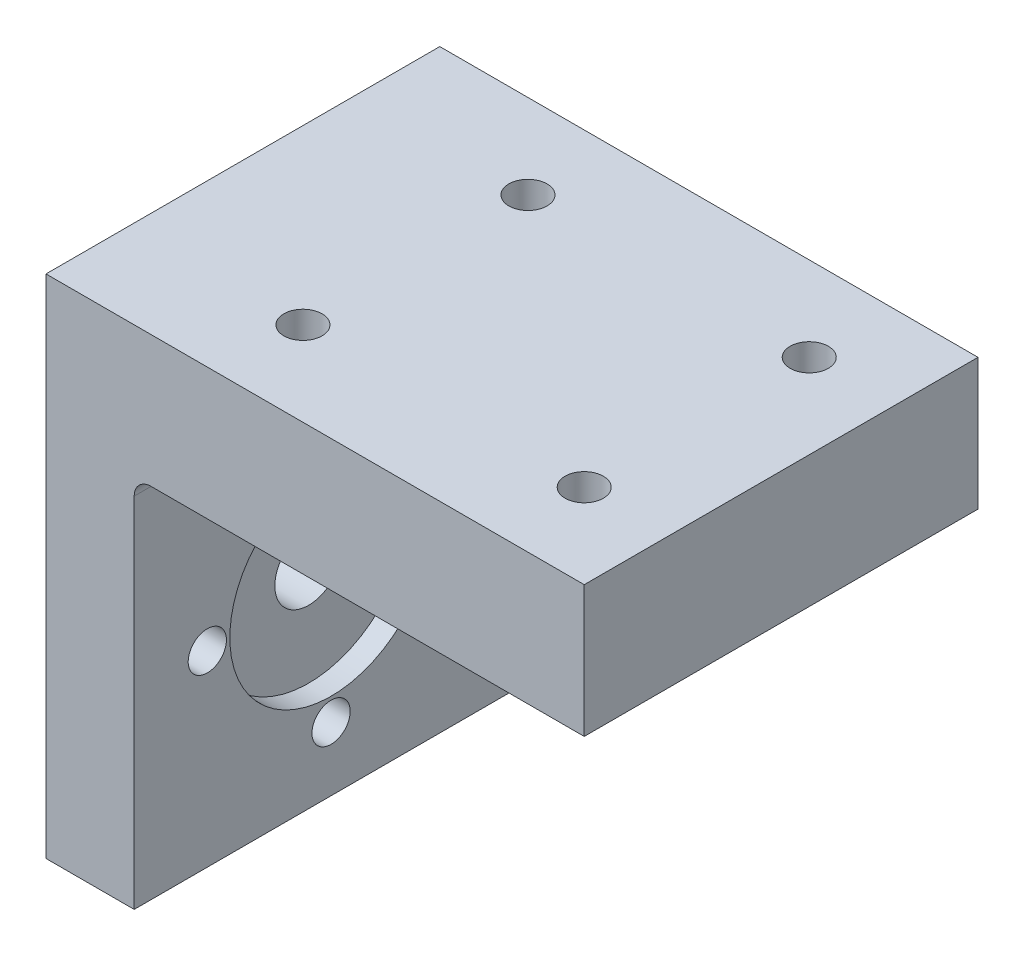
ISO-10303-21;
HEADER;
FILE_DESCRIPTION(('STEP AP214'),'2;1');
FILE_NAME('part.step','',(''),(''),'','','');
FILE_SCHEMA(('AUTOMOTIVE_DESIGN { 1 0 10303 214 1 1 1 1 }'));
ENDSEC;
DATA;
#1=APPLICATION_CONTEXT('core data for automotive mechanical design processes');
#2=APPLICATION_PROTOCOL_DEFINITION('international standard','automotive_design',2000,#1);
#3=PRODUCT_CONTEXT('',#1,'mechanical');
#4=PRODUCT('Part','Part','',(#3));
#5=PRODUCT_RELATED_PRODUCT_CATEGORY('part','',(#4));
#6=PRODUCT_DEFINITION_FORMATION('','',#4);
#7=PRODUCT_DEFINITION_CONTEXT('part definition',#1,'design');
#8=PRODUCT_DEFINITION('design','',#6,#7);
#9=PRODUCT_DEFINITION_SHAPE('','',#8);
#10=(LENGTH_UNIT() NAMED_UNIT(*) SI_UNIT(.MILLI.,.METRE.));
#11=(NAMED_UNIT(*) PLANE_ANGLE_UNIT() SI_UNIT($,.RADIAN.));
#12=(NAMED_UNIT(*) SI_UNIT($,.STERADIAN.) SOLID_ANGLE_UNIT());
#13=UNCERTAINTY_MEASURE_WITH_UNIT(LENGTH_MEASURE(1.E-05),#10,'distance_accuracy_value','');
#14=(GEOMETRIC_REPRESENTATION_CONTEXT(3) GLOBAL_UNCERTAINTY_ASSIGNED_CONTEXT((#13)) GLOBAL_UNIT_ASSIGNED_CONTEXT((#10,
#11,#12)) REPRESENTATION_CONTEXT('',''));
#15=CARTESIAN_POINT('',(0.,0.,0.));
#16=DIRECTION('',(0.,0.,1.));
#17=DIRECTION('',(1.,0.,0.));
#18=AXIS2_PLACEMENT_3D('',#15,#16,#17);
#19=CARTESIAN_POINT('',(-7.83844459402521,-5.84243165003538,0.));
#20=DIRECTION('',(1.,0.,0.));
#21=DIRECTION('',(0.,0.,-1.));
#22=AXIS2_PLACEMENT_3D('',#19,#20,#21);
#23=CYLINDRICAL_SURFACE('',#22,3.);
#24=CARTESIAN_POINT('',(-7.83844459402521,-5.84243165003538,0.));
#25=DIRECTION('',(1.,0.,0.));
#26=DIRECTION('',(0.,0.,-1.));
#27=AXIS2_PLACEMENT_3D('',#24,#25,#26);
#28=CIRCLE('',#27,3.);
#29=CARTESIAN_POINT('',(-7.83844459402521,-5.84243165003538,-3.));
#30=VERTEX_POINT('',#29);
#31=EDGE_CURVE('E131',#30,#30,#28,.T.);
#32=ORIENTED_EDGE('',*,*,#31,.F.);
#33=EDGE_LOOP('',(#32));
#34=FACE_BOUND('',#33,.T.);
#35=CARTESIAN_POINT('',(-2.,-5.84243165003538,0.));
#36=DIRECTION('',(1.,0.,0.));
#37=DIRECTION('',(0.,0.,-1.));
#38=AXIS2_PLACEMENT_3D('',#35,#36,#37);
#39=CIRCLE('',#38,3.);
#40=CARTESIAN_POINT('',(-2.,-5.84243165003538,-3.));
#41=VERTEX_POINT('',#40);
#42=EDGE_CURVE('E181',#41,#41,#39,.F.);
#43=ORIENTED_EDGE('',*,*,#42,.F.);
#44=EDGE_LOOP('',(#43));
#45=FACE_BOUND('',#44,.T.);
#46=ADVANCED_FACE('F46',(#34,#45),#23,.F.);
#47=CARTESIAN_POINT('',(-7.83844459402521,22.5,17.5));
#48=DIRECTION('',(0.,1.,0.));
#49=DIRECTION('',(0.,0.,1.));
#50=AXIS2_PLACEMENT_3D('',#47,#48,#49);
#51=PLANE('',#50);
#52=CARTESIAN_POINT('',(32.5,22.5,10.));
#53=DIRECTION('',(0.,-1.,0.));
#54=DIRECTION('',(0.,0.,-1.));
#55=AXIS2_PLACEMENT_3D('',#52,#53,#54);
#56=CIRCLE('',#55,1.7);
#57=CARTESIAN_POINT('',(32.5,22.5,8.30000000000001));
#58=VERTEX_POINT('',#57);
#59=EDGE_CURVE('E381',#58,#58,#56,.T.);
#60=ORIENTED_EDGE('',*,*,#59,.T.);
#61=EDGE_LOOP('',(#60));
#62=FACE_BOUND('',#61,.T.);
#63=CARTESIAN_POINT('',(7.5,22.5,-10.));
#64=DIRECTION('',(0.,-1.,0.));
#65=DIRECTION('',(0.,0.,-1.));
#66=AXIS2_PLACEMENT_3D('',#63,#64,#65);
#67=CIRCLE('',#66,1.7);
#68=CARTESIAN_POINT('',(7.5,22.5,-11.7));
#69=VERTEX_POINT('',#68);
#70=EDGE_CURVE('E374',#69,#69,#67,.T.);
#71=ORIENTED_EDGE('',*,*,#70,.T.);
#72=EDGE_LOOP('',(#71));
#73=FACE_BOUND('',#72,.T.);
#74=CARTESIAN_POINT('',(32.5,22.5,-9.99999999999999));
#75=DIRECTION('',(0.,-1.,0.));
#76=DIRECTION('',(0.,0.,-1.));
#77=AXIS2_PLACEMENT_3D('',#74,#75,#76);
#78=CIRCLE('',#77,1.7);
#79=CARTESIAN_POINT('',(32.5,22.5,-11.7));
#80=VERTEX_POINT('',#79);
#81=EDGE_CURVE('E457',#80,#80,#78,.T.);
#82=ORIENTED_EDGE('',*,*,#81,.T.);
#83=EDGE_LOOP('',(#82));
#84=FACE_BOUND('',#83,.T.);
#85=CARTESIAN_POINT('',(7.5,22.5,10.));
#86=DIRECTION('',(0.,-1.,0.));
#87=DIRECTION('',(0.,0.,-1.));
#88=AXIS2_PLACEMENT_3D('',#85,#86,#87);
#89=CIRCLE('',#88,1.7);
#90=CARTESIAN_POINT('',(7.5,22.5,8.30000000000001));
#91=VERTEX_POINT('',#90);
#92=EDGE_CURVE('E394',#91,#91,#89,.T.);
#93=ORIENTED_EDGE('',*,*,#92,.T.);
#94=EDGE_LOOP('',(#93));
#95=FACE_BOUND('',#94,.T.);
#96=DIRECTION('',(1.,0.,0.));
#97=VECTOR('',#96,1.);
#98=CARTESIAN_POINT('',(-7.83844459402521,22.5,17.5));
#99=LINE('',#98,#97);
#100=CARTESIAN_POINT('',(-7.83844459402521,22.5,17.5));
#101=VERTEX_POINT('',#100);
#102=CARTESIAN_POINT('',(40.,22.5,17.5));
#103=VERTEX_POINT('',#102);
#104=EDGE_CURVE('E104',#101,#103,#99,.T.);
#105=ORIENTED_EDGE('',*,*,#104,.T.);
#106=DIRECTION('',(0.,0.,1.));
#107=VECTOR('',#106,1.);
#108=CARTESIAN_POINT('',(40.,22.5,17.5));
#109=LINE('',#108,#107);
#110=CARTESIAN_POINT('',(40.,22.5,-17.5));
#111=VERTEX_POINT('',#110);
#112=EDGE_CURVE('E108',#111,#103,#109,.T.);
#113=ORIENTED_EDGE('',*,*,#112,.F.);
#114=DIRECTION('',(1.,0.,0.));
#115=VECTOR('',#114,1.);
#116=CARTESIAN_POINT('',(-7.83844459402521,22.5,-17.5));
#117=LINE('',#116,#115);
#118=CARTESIAN_POINT('',(-7.83844459402521,22.5,-17.5));
#119=VERTEX_POINT('',#118);
#120=EDGE_CURVE('E175',#119,#111,#117,.T.);
#121=ORIENTED_EDGE('',*,*,#120,.F.);
#122=DIRECTION('',(0.,0.,1.));
#123=VECTOR('',#122,1.);
#124=CARTESIAN_POINT('',(-7.83844459402521,22.5,17.5));
#125=LINE('',#124,#123);
#126=EDGE_CURVE('E112',#119,#101,#125,.T.);
#127=ORIENTED_EDGE('',*,*,#126,.T.);
#128=EDGE_LOOP('',(#105,#113,#121,#127));
#129=FACE_BOUND('',#128,.T.);
#130=ADVANCED_FACE('F110',(#62,#73,#84,#95,#129),#51,.T.);
#131=CARTESIAN_POINT('',(-7.83844459402521,-22.5,-17.5));
#132=DIRECTION('',(0.,0.,-1.));
#133=DIRECTION('',(-1.,0.,0.));
#134=AXIS2_PLACEMENT_3D('',#131,#132,#133);
#135=PLANE('',#134);
#136=DIRECTION('',(0.,1.,0.));
#137=VECTOR('',#136,1.);
#138=CARTESIAN_POINT('',(0.,-22.5,-17.5));
#139=LINE('',#138,#137);
#140=CARTESIAN_POINT('',(0.,-22.5,-17.5));
#141=VERTEX_POINT('',#140);
#142=CARTESIAN_POINT('',(0.,9.31513669992924,-17.5));
#143=VERTEX_POINT('',#142);
#144=EDGE_CURVE('E154',#141,#143,#139,.T.);
#145=ORIENTED_EDGE('',*,*,#144,.F.);
#146=DIRECTION('',(1.,0.,0.));
#147=VECTOR('',#146,1.);
#148=CARTESIAN_POINT('',(-7.83844459402521,-22.5,-17.5));
#149=LINE('',#148,#147);
#150=CARTESIAN_POINT('',(-7.83844459402521,-22.5,-17.5));
#151=VERTEX_POINT('',#150);
#152=EDGE_CURVE('E180',#151,#141,#149,.T.);
#153=ORIENTED_EDGE('',*,*,#152,.F.);
#154=DIRECTION('',(0.,1.,0.));
#155=VECTOR('',#154,1.);
#156=CARTESIAN_POINT('',(-7.83844459402521,-22.5,-17.5));
#157=LINE('',#156,#155);
#158=EDGE_CURVE('E119',#151,#119,#157,.T.);
#159=ORIENTED_EDGE('',*,*,#158,.T.);
#160=ORIENTED_EDGE('',*,*,#120,.T.);
#161=DIRECTION('',(0.,1.,0.));
#162=VECTOR('',#161,1.);
#163=CARTESIAN_POINT('',(40.,22.5,-17.5));
#164=LINE('',#163,#162);
#165=CARTESIAN_POINT('',(40.,10.8151366999293,-17.5));
#166=VERTEX_POINT('',#165);
#167=EDGE_CURVE('E134',#166,#111,#164,.T.);
#168=ORIENTED_EDGE('',*,*,#167,.F.);
#169=DIRECTION('',(-1.,0.,0.));
#170=VECTOR('',#169,1.);
#171=CARTESIAN_POINT('',(40.,10.8151366999293,-17.5));
#172=LINE('',#171,#170);
#173=CARTESIAN_POINT('',(1.5,10.8151366999293,-17.5));
#174=VERTEX_POINT('',#173);
#175=EDGE_CURVE('E148',#166,#174,#172,.T.);
#176=ORIENTED_EDGE('',*,*,#175,.T.);
#177=CARTESIAN_POINT('',(1.5,9.31513669992926,-17.5));
#178=DIRECTION('',(0.,0.,-1.));
#179=DIRECTION('',(-1.,0.,0.));
#180=AXIS2_PLACEMENT_3D('',#177,#178,#179);
#181=CIRCLE('',#180,1.5);
#182=EDGE_CURVE('E54',#174,#143,#181,.F.);
#183=ORIENTED_EDGE('',*,*,#182,.T.);
#184=EDGE_LOOP('',(#145,#153,#159,#160,#168,#176,#183));
#185=FACE_BOUND('',#184,.T.);
#186=ADVANCED_FACE('F199',(#185),#135,.T.);
#187=CARTESIAN_POINT('',(-7.83844459402521,-22.5,17.5));
#188=DIRECTION('',(0.,-1.,0.));
#189=DIRECTION('',(0.,0.,-1.));
#190=AXIS2_PLACEMENT_3D('',#187,#188,#189);
#191=PLANE('',#190);
#192=DIRECTION('',(0.,0.,-1.));
#193=VECTOR('',#192,1.);
#194=CARTESIAN_POINT('',(0.,-22.5,17.5));
#195=LINE('',#194,#193);
#196=CARTESIAN_POINT('',(0.,-22.5,17.5));
#197=VERTEX_POINT('',#196);
#198=EDGE_CURVE('E170',#197,#141,#195,.T.);
#199=ORIENTED_EDGE('',*,*,#198,.F.);
#200=DIRECTION('',(1.,0.,0.));
#201=VECTOR('',#200,1.);
#202=CARTESIAN_POINT('',(-7.83844459402521,-22.5,17.5));
#203=LINE('',#202,#201);
#204=CARTESIAN_POINT('',(-7.83844459402521,-22.5,17.5));
#205=VERTEX_POINT('',#204);
#206=EDGE_CURVE('E117',#205,#197,#203,.T.);
#207=ORIENTED_EDGE('',*,*,#206,.F.);
#208=DIRECTION('',(0.,0.,-1.));
#209=VECTOR('',#208,1.);
#210=CARTESIAN_POINT('',(-7.83844459402521,-22.5,17.5));
#211=LINE('',#210,#209);
#212=EDGE_CURVE('E158',#205,#151,#211,.T.);
#213=ORIENTED_EDGE('',*,*,#212,.T.);
#214=ORIENTED_EDGE('',*,*,#152,.T.);
#215=EDGE_LOOP('',(#199,#207,#213,#214));
#216=FACE_BOUND('',#215,.T.);
#217=ADVANCED_FACE('F210',(#216),#191,.T.);
#218=CARTESIAN_POINT('',(-7.83844459402521,-22.5,17.5));
#219=DIRECTION('',(0.,0.,1.));
#220=DIRECTION('',(1.,0.,0.));
#221=AXIS2_PLACEMENT_3D('',#218,#219,#220);
#222=PLANE('',#221);
#223=DIRECTION('',(0.,-1.,0.));
#224=VECTOR('',#223,1.);
#225=CARTESIAN_POINT('',(0.,-22.5,17.5));
#226=LINE('',#225,#224);
#227=CARTESIAN_POINT('',(0.,9.31513669992924,17.5));
#228=VERTEX_POINT('',#227);
#229=EDGE_CURVE('E151',#228,#197,#226,.T.);
#230=ORIENTED_EDGE('',*,*,#229,.F.);
#231=CARTESIAN_POINT('',(1.5,9.31513669992925,17.5));
#232=DIRECTION('',(0.,0.,1.));
#233=DIRECTION('',(1.,0.,0.));
#234=AXIS2_PLACEMENT_3D('',#231,#232,#233);
#235=CIRCLE('',#234,1.5);
#236=CARTESIAN_POINT('',(1.5,10.8151366999293,17.5));
#237=VERTEX_POINT('',#236);
#238=EDGE_CURVE('E11',#228,#237,#235,.F.);
#239=ORIENTED_EDGE('',*,*,#238,.T.);
#240=DIRECTION('',(-1.,0.,0.));
#241=VECTOR('',#240,1.);
#242=CARTESIAN_POINT('',(40.,10.8151366999293,17.5));
#243=LINE('',#242,#241);
#244=CARTESIAN_POINT('',(40.,10.8151366999293,17.5));
#245=VERTEX_POINT('',#244);
#246=EDGE_CURVE('E123',#245,#237,#243,.T.);
#247=ORIENTED_EDGE('',*,*,#246,.F.);
#248=DIRECTION('',(0.,-1.,0.));
#249=VECTOR('',#248,1.);
#250=CARTESIAN_POINT('',(40.,22.5,17.5));
#251=LINE('',#250,#249);
#252=EDGE_CURVE('E118',#103,#245,#251,.T.);
#253=ORIENTED_EDGE('',*,*,#252,.F.);
#254=ORIENTED_EDGE('',*,*,#104,.F.);
#255=DIRECTION('',(0.,-1.,0.));
#256=VECTOR('',#255,1.);
#257=CARTESIAN_POINT('',(-7.83844459402521,-22.5,17.5));
#258=LINE('',#257,#256);
#259=EDGE_CURVE('E152',#101,#205,#258,.T.);
#260=ORIENTED_EDGE('',*,*,#259,.T.);
#261=ORIENTED_EDGE('',*,*,#206,.T.);
#262=EDGE_LOOP('',(#230,#239,#247,#253,#254,#260,#261));
#263=FACE_BOUND('',#262,.T.);
#264=ADVANCED_FACE('F122',(#263),#222,.T.);
#265=CARTESIAN_POINT('',(-7.83844459402521,0.,0.));
#266=DIRECTION('',(1.,0.,0.));
#267=DIRECTION('',(0.,0.,-1.));
#268=AXIS2_PLACEMENT_3D('',#265,#266,#267);
#269=PLANE('',#268);
#270=CARTESIAN_POINT('',(-7.83844459402521,-5.84243165003538,11.));
#271=DIRECTION('',(1.,0.,0.));
#272=DIRECTION('',(0.,0.,-1.));
#273=AXIS2_PLACEMENT_3D('',#270,#271,#272);
#274=CIRCLE('',#273,1.7);
#275=CARTESIAN_POINT('',(-7.83844459402521,-5.84243165003538,9.3));
#276=VERTEX_POINT('',#275);
#277=EDGE_CURVE('E426',#276,#276,#274,.T.);
#278=ORIENTED_EDGE('',*,*,#277,.T.);
#279=EDGE_LOOP('',(#278));
#280=FACE_BOUND('',#279,.T.);
#281=CARTESIAN_POINT('',(-7.83844459402521,-16.8424316500352,-1.90819582357449E-13));
#282=DIRECTION('',(1.,0.,0.));
#283=DIRECTION('',(0.,0.,-1.));
#284=AXIS2_PLACEMENT_3D('',#281,#282,#283);
#285=CIRCLE('',#284,1.7);
#286=CARTESIAN_POINT('',(-7.83844459402521,-16.8424316500352,-1.70000000000019));
#287=VERTEX_POINT('',#286);
#288=EDGE_CURVE('E413',#287,#287,#285,.T.);
#289=ORIENTED_EDGE('',*,*,#288,.T.);
#290=EDGE_LOOP('',(#289));
#291=FACE_BOUND('',#290,.T.);
#292=CARTESIAN_POINT('',(-7.83844459402521,-5.84243165003499,-11.));
#293=DIRECTION('',(1.,0.,0.));
#294=DIRECTION('',(0.,0.,-1.));
#295=AXIS2_PLACEMENT_3D('',#292,#293,#294);
#296=CIRCLE('',#295,1.7);
#297=CARTESIAN_POINT('',(-7.83844459402521,-5.84243165003499,-12.7));
#298=VERTEX_POINT('',#297);
#299=EDGE_CURVE('E415',#298,#298,#296,.T.);
#300=ORIENTED_EDGE('',*,*,#299,.T.);
#301=EDGE_LOOP('',(#300));
#302=FACE_BOUND('',#301,.T.);
#303=CARTESIAN_POINT('',(-7.83844459402521,5.15756834996478,2.69749500514394E-13));
#304=DIRECTION('',(1.,0.,0.));
#305=DIRECTION('',(0.,0.,-1.));
#306=AXIS2_PLACEMENT_3D('',#303,#304,#305);
#307=CIRCLE('',#306,1.7);
#308=CARTESIAN_POINT('',(-7.83844459402521,5.15756834996478,-1.69999999999973));
#309=VERTEX_POINT('',#308);
#310=EDGE_CURVE('E189',#309,#309,#307,.T.);
#311=ORIENTED_EDGE('',*,*,#310,.T.);
#312=EDGE_LOOP('',(#311));
#313=FACE_BOUND('',#312,.T.);
#314=ORIENTED_EDGE('',*,*,#31,.T.);
#315=EDGE_LOOP('',(#314));
#316=FACE_BOUND('',#315,.T.);
#317=ORIENTED_EDGE('',*,*,#126,.F.);
#318=ORIENTED_EDGE('',*,*,#158,.F.);
#319=ORIENTED_EDGE('',*,*,#212,.F.);
#320=ORIENTED_EDGE('',*,*,#259,.F.);
#321=EDGE_LOOP('',(#317,#318,#319,#320));
#322=FACE_BOUND('',#321,.T.);
#323=ADVANCED_FACE('F201',(#280,#291,#302,#313,#316,#322),#269,.F.);
#324=CARTESIAN_POINT('',(0.,0.,0.));
#325=DIRECTION('',(1.,0.,0.));
#326=DIRECTION('',(0.,0.,-1.));
#327=AXIS2_PLACEMENT_3D('',#324,#325,#326);
#328=PLANE('',#327);
#329=CARTESIAN_POINT('',(0.,-5.84243165003538,0.));
#330=DIRECTION('',(1.,0.,0.));
#331=DIRECTION('',(0.,0.,-1.));
#332=AXIS2_PLACEMENT_3D('',#329,#330,#331);
#333=CIRCLE('',#332,9.);
#334=CARTESIAN_POINT('',(0.,-5.84243165003538,-9.));
#335=VERTEX_POINT('',#334);
#336=EDGE_CURVE('E397',#335,#335,#333,.T.);
#337=ORIENTED_EDGE('',*,*,#336,.F.);
#338=EDGE_LOOP('',(#337));
#339=FACE_BOUND('',#338,.T.);
#340=CARTESIAN_POINT('',(0.,-5.84243165003538,11.));
#341=DIRECTION('',(1.,0.,0.));
#342=DIRECTION('',(0.,0.,-1.));
#343=AXIS2_PLACEMENT_3D('',#340,#341,#342);
#344=CIRCLE('',#343,1.7);
#345=CARTESIAN_POINT('',(0.,-5.84243165003538,9.3));
#346=VERTEX_POINT('',#345);
#347=EDGE_CURVE('E136',#346,#346,#344,.T.);
#348=ORIENTED_EDGE('',*,*,#347,.F.);
#349=EDGE_LOOP('',(#348));
#350=FACE_BOUND('',#349,.T.);
#351=CARTESIAN_POINT('',(0.,-16.8424316500352,-1.90819582357449E-13));
#352=DIRECTION('',(1.,0.,0.));
#353=DIRECTION('',(0.,0.,-1.));
#354=AXIS2_PLACEMENT_3D('',#351,#352,#353);
#355=CIRCLE('',#354,1.7);
#356=CARTESIAN_POINT('',(0.,-16.8424316500352,-1.70000000000019));
#357=VERTEX_POINT('',#356);
#358=EDGE_CURVE('E429',#357,#357,#355,.T.);
#359=ORIENTED_EDGE('',*,*,#358,.F.);
#360=EDGE_LOOP('',(#359));
#361=FACE_BOUND('',#360,.T.);
#362=CARTESIAN_POINT('',(0.,-5.84243165003499,-11.));
#363=DIRECTION('',(1.,0.,0.));
#364=DIRECTION('',(0.,0.,-1.));
#365=AXIS2_PLACEMENT_3D('',#362,#363,#364);
#366=CIRCLE('',#365,1.7);
#367=CARTESIAN_POINT('',(0.,-5.84243165003499,-12.7));
#368=VERTEX_POINT('',#367);
#369=EDGE_CURVE('E409',#368,#368,#366,.T.);
#370=ORIENTED_EDGE('',*,*,#369,.F.);
#371=EDGE_LOOP('',(#370));
#372=FACE_BOUND('',#371,.T.);
#373=CARTESIAN_POINT('',(0.,5.15756834996478,2.69749500514394E-13));
#374=DIRECTION('',(1.,0.,0.));
#375=DIRECTION('',(0.,0.,-1.));
#376=AXIS2_PLACEMENT_3D('',#373,#374,#375);
#377=CIRCLE('',#376,1.7);
#378=CARTESIAN_POINT('',(0.,5.15756834996478,-1.69999999999973));
#379=VERTEX_POINT('',#378);
#380=EDGE_CURVE('E418',#379,#379,#377,.T.);
#381=ORIENTED_EDGE('',*,*,#380,.F.);
#382=EDGE_LOOP('',(#381));
#383=FACE_BOUND('',#382,.T.);
#384=ORIENTED_EDGE('',*,*,#144,.T.);
#385=DIRECTION('',(0.,0.,-1.));
#386=VECTOR('',#385,1.);
#387=CARTESIAN_POINT('',(0.,9.31513669992926,0.));
#388=LINE('',#387,#386);
#389=EDGE_CURVE('E68',#143,#228,#388,.F.);
#390=ORIENTED_EDGE('',*,*,#389,.T.);
#391=ORIENTED_EDGE('',*,*,#229,.T.);
#392=ORIENTED_EDGE('',*,*,#198,.T.);
#393=EDGE_LOOP('',(#384,#390,#391,#392));
#394=FACE_BOUND('',#393,.T.);
#395=ADVANCED_FACE('F208',(#339,#350,#361,#372,#383,#394),#328,.T.);
#396=CARTESIAN_POINT('',(40.,10.8151366999293,17.5));
#397=DIRECTION('',(0.,1.,0.));
#398=DIRECTION('',(0.,0.,1.));
#399=AXIS2_PLACEMENT_3D('',#396,#397,#398);
#400=PLANE('',#399);
#401=CARTESIAN_POINT('',(32.5,10.8151366999293,10.));
#402=DIRECTION('',(0.,-1.,0.));
#403=DIRECTION('',(0.,0.,-1.));
#404=AXIS2_PLACEMENT_3D('',#401,#402,#403);
#405=CIRCLE('',#404,1.7);
#406=CARTESIAN_POINT('',(32.5,10.8151366999293,8.30000000000001));
#407=VERTEX_POINT('',#406);
#408=EDGE_CURVE('E387',#407,#407,#405,.T.);
#409=ORIENTED_EDGE('',*,*,#408,.F.);
#410=EDGE_LOOP('',(#409));
#411=FACE_BOUND('',#410,.T.);
#412=CARTESIAN_POINT('',(7.5,10.8151366999293,-10.));
#413=DIRECTION('',(0.,-1.,0.));
#414=DIRECTION('',(0.,0.,-1.));
#415=AXIS2_PLACEMENT_3D('',#412,#413,#414);
#416=CIRCLE('',#415,1.7);
#417=CARTESIAN_POINT('',(7.5,10.8151366999293,-11.7));
#418=VERTEX_POINT('',#417);
#419=EDGE_CURVE('E378',#418,#418,#416,.T.);
#420=ORIENTED_EDGE('',*,*,#419,.F.);
#421=EDGE_LOOP('',(#420));
#422=FACE_BOUND('',#421,.T.);
#423=CARTESIAN_POINT('',(32.5,10.8151366999293,-9.99999999999999));
#424=DIRECTION('',(0.,-1.,0.));
#425=DIRECTION('',(0.,0.,-1.));
#426=AXIS2_PLACEMENT_3D('',#423,#424,#425);
#427=CIRCLE('',#426,1.7);
#428=CARTESIAN_POINT('',(32.5,10.8151366999293,-11.7));
#429=VERTEX_POINT('',#428);
#430=EDGE_CURVE('E389',#429,#429,#427,.T.);
#431=ORIENTED_EDGE('',*,*,#430,.F.);
#432=EDGE_LOOP('',(#431));
#433=FACE_BOUND('',#432,.T.);
#434=CARTESIAN_POINT('',(7.5,10.8151366999293,10.));
#435=DIRECTION('',(0.,-1.,0.));
#436=DIRECTION('',(0.,0.,-1.));
#437=AXIS2_PLACEMENT_3D('',#434,#435,#436);
#438=CIRCLE('',#437,1.7);
#439=CARTESIAN_POINT('',(7.5,10.8151366999293,8.30000000000001));
#440=VERTEX_POINT('',#439);
#441=EDGE_CURVE('E400',#440,#440,#438,.T.);
#442=ORIENTED_EDGE('',*,*,#441,.F.);
#443=EDGE_LOOP('',(#442));
#444=FACE_BOUND('',#443,.T.);
#445=ORIENTED_EDGE('',*,*,#246,.T.);
#446=DIRECTION('',(0.,0.,-1.));
#447=VECTOR('',#446,1.);
#448=CARTESIAN_POINT('',(1.5,10.8151366999293,17.5));
#449=LINE('',#448,#447);
#450=EDGE_CURVE('E177',#237,#174,#449,.T.);
#451=ORIENTED_EDGE('',*,*,#450,.T.);
#452=ORIENTED_EDGE('',*,*,#175,.F.);
#453=DIRECTION('',(0.,0.,-1.));
#454=VECTOR('',#453,1.);
#455=CARTESIAN_POINT('',(40.,10.8151366999293,17.5));
#456=LINE('',#455,#454);
#457=EDGE_CURVE('E130',#245,#166,#456,.T.);
#458=ORIENTED_EDGE('',*,*,#457,.F.);
#459=EDGE_LOOP('',(#445,#451,#452,#458));
#460=FACE_BOUND('',#459,.T.);
#461=ADVANCED_FACE('F197',(#411,#422,#433,#444,#460),#400,.F.);
#462=CARTESIAN_POINT('',(40.,0.,0.));
#463=DIRECTION('',(-1.,0.,0.));
#464=DIRECTION('',(0.,0.,1.));
#465=AXIS2_PLACEMENT_3D('',#462,#463,#464);
#466=PLANE('',#465);
#467=ORIENTED_EDGE('',*,*,#112,.T.);
#468=ORIENTED_EDGE('',*,*,#252,.T.);
#469=ORIENTED_EDGE('',*,*,#457,.T.);
#470=ORIENTED_EDGE('',*,*,#167,.T.);
#471=EDGE_LOOP('',(#467,#468,#469,#470));
#472=FACE_BOUND('',#471,.T.);
#473=ADVANCED_FACE('F128',(#472),#466,.F.);
#474=CARTESIAN_POINT('',(-7.83844459402521,5.15756834996478,2.69749500514394E-13));
#475=DIRECTION('',(1.,0.,0.));
#476=DIRECTION('',(0.,0.,-1.));
#477=AXIS2_PLACEMENT_3D('',#474,#475,#476);
#478=CYLINDRICAL_SURFACE('',#477,1.7);
#479=ORIENTED_EDGE('',*,*,#310,.F.);
#480=EDGE_LOOP('',(#479));
#481=FACE_BOUND('',#480,.T.);
#482=ORIENTED_EDGE('',*,*,#380,.T.);
#483=EDGE_LOOP('',(#482));
#484=FACE_BOUND('',#483,.T.);
#485=ADVANCED_FACE('F231',(#481,#484),#478,.F.);
#486=CARTESIAN_POINT('',(-7.83844459402521,-5.84243165003499,-11.));
#487=DIRECTION('',(1.,0.,0.));
#488=DIRECTION('',(0.,0.,-1.));
#489=AXIS2_PLACEMENT_3D('',#486,#487,#488);
#490=CYLINDRICAL_SURFACE('',#489,1.7);
#491=ORIENTED_EDGE('',*,*,#299,.F.);
#492=EDGE_LOOP('',(#491));
#493=FACE_BOUND('',#492,.T.);
#494=ORIENTED_EDGE('',*,*,#369,.T.);
#495=EDGE_LOOP('',(#494));
#496=FACE_BOUND('',#495,.T.);
#497=ADVANCED_FACE('F282',(#493,#496),#490,.F.);
#498=CARTESIAN_POINT('',(-7.83844459402521,-16.8424316500352,-1.90819582357449E-13));
#499=DIRECTION('',(1.,0.,0.));
#500=DIRECTION('',(0.,0.,-1.));
#501=AXIS2_PLACEMENT_3D('',#498,#499,#500);
#502=CYLINDRICAL_SURFACE('',#501,1.7);
#503=ORIENTED_EDGE('',*,*,#288,.F.);
#504=EDGE_LOOP('',(#503));
#505=FACE_BOUND('',#504,.T.);
#506=ORIENTED_EDGE('',*,*,#358,.T.);
#507=EDGE_LOOP('',(#506));
#508=FACE_BOUND('',#507,.T.);
#509=ADVANCED_FACE('F232',(#505,#508),#502,.F.);
#510=CARTESIAN_POINT('',(-7.83844459402521,-5.84243165003538,11.));
#511=DIRECTION('',(1.,0.,0.));
#512=DIRECTION('',(0.,0.,-1.));
#513=AXIS2_PLACEMENT_3D('',#510,#511,#512);
#514=CYLINDRICAL_SURFACE('',#513,1.7);
#515=ORIENTED_EDGE('',*,*,#277,.F.);
#516=EDGE_LOOP('',(#515));
#517=FACE_BOUND('',#516,.T.);
#518=ORIENTED_EDGE('',*,*,#347,.T.);
#519=EDGE_LOOP('',(#518));
#520=FACE_BOUND('',#519,.T.);
#521=ADVANCED_FACE('F298',(#517,#520),#514,.F.);
#522=CARTESIAN_POINT('',(-2.,-5.84243165003538,0.));
#523=DIRECTION('',(1.,0.,0.));
#524=DIRECTION('',(0.,0.,-1.));
#525=AXIS2_PLACEMENT_3D('',#522,#523,#524);
#526=PLANE('',#525);
#527=CARTESIAN_POINT('',(-2.,-5.84243165003538,0.));
#528=DIRECTION('',(1.,0.,0.));
#529=DIRECTION('',(0.,0.,-1.));
#530=AXIS2_PLACEMENT_3D('',#527,#528,#529);
#531=CIRCLE('',#530,9.);
#532=CARTESIAN_POINT('',(-2.,-5.84243165003538,-9.));
#533=VERTEX_POINT('',#532);
#534=EDGE_CURVE('E190',#533,#533,#531,.T.);
#535=ORIENTED_EDGE('',*,*,#534,.T.);
#536=EDGE_LOOP('',(#535));
#537=FACE_BOUND('',#536,.T.);
#538=ORIENTED_EDGE('',*,*,#42,.T.);
#539=EDGE_LOOP('',(#538));
#540=FACE_BOUND('',#539,.T.);
#541=ADVANCED_FACE('F306',(#537,#540),#526,.T.);
#542=CARTESIAN_POINT('',(-2.,-5.84243165003538,0.));
#543=DIRECTION('',(1.,0.,0.));
#544=DIRECTION('',(0.,0.,-1.));
#545=AXIS2_PLACEMENT_3D('',#542,#543,#544);
#546=CYLINDRICAL_SURFACE('',#545,9.);
#547=ORIENTED_EDGE('',*,*,#534,.F.);
#548=EDGE_LOOP('',(#547));
#549=FACE_BOUND('',#548,.T.);
#550=ORIENTED_EDGE('',*,*,#336,.T.);
#551=EDGE_LOOP('',(#550));
#552=FACE_BOUND('',#551,.T.);
#553=ADVANCED_FACE('F319',(#549,#552),#546,.F.);
#554=CARTESIAN_POINT('',(7.5,22.5,10.));
#555=DIRECTION('',(0.,-1.,0.));
#556=DIRECTION('',(0.,0.,-1.));
#557=AXIS2_PLACEMENT_3D('',#554,#555,#556);
#558=CYLINDRICAL_SURFACE('',#557,1.7);
#559=CARTESIAN_POINT('',(7.5,22.5,8.30000000000001));
#560=CARTESIAN_POINT('',(7.5,22.3782826739576,8.30000000000001));
#561=CARTESIAN_POINT('',(7.5,22.2565653479152,8.30000000000001));
#562=CARTESIAN_POINT('',(7.5,22.0131306958304,8.30000000000001));
#563=CARTESIAN_POINT('',(7.5,21.891413369788,8.30000000000001));
#564=CARTESIAN_POINT('',(7.5,21.6479787177032,8.30000000000001));
#565=CARTESIAN_POINT('',(7.5,21.5262613916608,8.30000000000001));
#566=CARTESIAN_POINT('',(7.5,21.282826739576,8.30000000000001));
#567=CARTESIAN_POINT('',(7.5,21.1611094135336,8.30000000000001));
#568=CARTESIAN_POINT('',(7.5,20.9176747614488,8.30000000000001));
#569=CARTESIAN_POINT('',(7.5,20.7959574354064,8.30000000000001));
#570=CARTESIAN_POINT('',(7.5,20.5525227833215,8.30000000000001));
#571=CARTESIAN_POINT('',(7.5,20.4308054572791,8.30000000000001));
#572=CARTESIAN_POINT('',(7.5,20.1873708051943,8.30000000000001));
#573=CARTESIAN_POINT('',(7.5,20.0656534791519,8.30000000000001));
#574=CARTESIAN_POINT('',(7.5,19.8222188270671,8.30000000000001));
#575=CARTESIAN_POINT('',(7.5,19.7005015010247,8.30000000000001));
#576=CARTESIAN_POINT('',(7.5,19.4570668489399,8.30000000000001));
#577=CARTESIAN_POINT('',(7.5,19.3353495228975,8.30000000000001));
#578=CARTESIAN_POINT('',(7.5,19.0919148708127,8.30000000000001));
#579=CARTESIAN_POINT('',(7.5,18.9701975447703,8.30000000000001));
#580=CARTESIAN_POINT('',(7.5,18.7267628926855,8.30000000000001));
#581=CARTESIAN_POINT('',(7.5,18.6050455666431,8.30000000000001));
#582=CARTESIAN_POINT('',(7.5,18.3616109145583,8.30000000000001));
#583=CARTESIAN_POINT('',(7.5,18.2398935885159,8.30000000000001));
#584=CARTESIAN_POINT('',(7.5,17.9964589364311,8.30000000000001));
#585=CARTESIAN_POINT('',(7.5,17.8747416103887,8.30000000000001));
#586=CARTESIAN_POINT('',(7.5,17.6313069583039,8.30000000000001));
#587=CARTESIAN_POINT('',(7.5,17.5095896322615,8.30000000000001));
#588=CARTESIAN_POINT('',(7.5,17.2661549801766,8.30000000000001));
#589=CARTESIAN_POINT('',(7.5,17.1444376541342,8.30000000000001));
#590=CARTESIAN_POINT('',(7.5,16.9010030020494,8.30000000000001));
#591=CARTESIAN_POINT('',(7.5,16.779285676007,8.30000000000001));
#592=CARTESIAN_POINT('',(7.5,16.5358510239222,8.30000000000001));
#593=CARTESIAN_POINT('',(7.5,16.4141336978798,8.30000000000001));
#594=CARTESIAN_POINT('',(7.5,16.170699045795,8.30000000000001));
#595=CARTESIAN_POINT('',(7.5,16.0489817197526,8.30000000000001));
#596=CARTESIAN_POINT('',(7.5,15.8055470676678,8.30000000000001));
#597=CARTESIAN_POINT('',(7.5,15.6838297416254,8.30000000000001));
#598=CARTESIAN_POINT('',(7.5,15.4403950895406,8.30000000000001));
#599=CARTESIAN_POINT('',(7.5,15.3186777634982,8.30000000000001));
#600=CARTESIAN_POINT('',(7.5,15.0752431114134,8.30000000000001));
#601=CARTESIAN_POINT('',(7.5,14.953525785371,8.30000000000001));
#602=CARTESIAN_POINT('',(7.5,14.7100911332862,8.30000000000001));
#603=CARTESIAN_POINT('',(7.5,14.5883738072438,8.30000000000001));
#604=CARTESIAN_POINT('',(7.5,14.344939155159,8.30000000000001));
#605=CARTESIAN_POINT('',(7.5,14.2232218291166,8.30000000000001));
#606=CARTESIAN_POINT('',(7.5,13.9797871770317,8.30000000000001));
#607=CARTESIAN_POINT('',(7.5,13.8580698509893,8.30000000000001));
#608=CARTESIAN_POINT('',(7.5,13.6146351989045,8.30000000000001));
#609=CARTESIAN_POINT('',(7.5,13.4929178728621,8.30000000000001));
#610=CARTESIAN_POINT('',(7.5,13.2494832207773,8.30000000000001));
#611=CARTESIAN_POINT('',(7.5,13.1277658947349,8.30000000000001));
#612=CARTESIAN_POINT('',(7.5,12.8843312426501,8.30000000000001));
#613=CARTESIAN_POINT('',(7.5,12.7626139166077,8.30000000000001));
#614=CARTESIAN_POINT('',(7.5,12.5191792645229,8.30000000000001));
#615=CARTESIAN_POINT('',(7.5,12.3974619384805,8.30000000000001));
#616=CARTESIAN_POINT('',(7.5,12.1540272863957,8.30000000000001));
#617=CARTESIAN_POINT('',(7.5,12.0323099603533,8.30000000000001));
#618=CARTESIAN_POINT('',(7.5,11.7888753082685,8.30000000000001));
#619=CARTESIAN_POINT('',(7.5,11.6671579822261,8.30000000000001));
#620=CARTESIAN_POINT('',(7.5,11.4237233301413,8.30000000000001));
#621=CARTESIAN_POINT('',(7.5,11.3020060040989,8.30000000000001));
#622=CARTESIAN_POINT('',(7.5,11.0585713520141,8.30000000000001));
#623=CARTESIAN_POINT('',(7.5,10.9368540259717,8.30000000000001));
#624=CARTESIAN_POINT('',(7.5,10.8151366999293,8.30000000000001));
#625=B_SPLINE_CURVE_WITH_KNOTS('',3,(#559,#560,#561,#562,#563,#564,#565,#566,#567,#568,#569,
#570,#571,#572,#573,#574,#575,#576,#577,#578,#579,#580,#581,#582,#583,#584,#585,#586,#587,#588,
#589,#590,#591,#592,#593,#594,#595,#596,#597,#598,#599,#600,#601,#602,#603,#604,#605,#606,#607,
#608,#609,#610,#611,#612,#613,#614,#615,#616,#617,#618,#619,#620,#621,#622,#623,#624),
.UNSPECIFIED.,.F.,.F.,(4,2,2,2,2,2,2,2,2,2,2,2,2,2,2,2,2,2,2,2,2,2,2,2,2,2,2,2,2,2,2,2,4),(0.,
0.365151978127212,0.730303956254424,1.09545593438163,1.46060791250885,1.82575989063606,
2.19091186876327,2.55606384689048,2.92121582501769,3.2863678031449,3.65151978127211,
4.01667175939932,4.38182373752653,4.74697571565374,5.11212769378095,5.47727967190817,
5.84243165003538,6.20758362816258,6.5727356062898,6.93788758441701,7.30303956254422,
7.66819154067143,8.03334351879864,8.39849549692585,8.76364747505306,9.12879945318027,
9.49395143130748,9.85910340943469,10.2242553875619,10.5894073656891,10.9545593438163,
11.3197113219435,11.6848633000707),.UNSPECIFIED.);
#626=EDGE_CURVE('BSEAM329',#91,#440,#625,.T.);
#627=ORIENTED_EDGE('',*,*,#92,.F.);
#628=ORIENTED_EDGE('',*,*,#441,.T.);
#629=ORIENTED_EDGE('',*,*,#626,.T.);
#630=ORIENTED_EDGE('',*,*,#626,.F.);
#631=EDGE_LOOP('',(#627,#629,#628,#630));
#632=FACE_BOUND('',#631,.T.);
#633=ADVANCED_FACE('F329',(#632),#558,.F.);
#634=CARTESIAN_POINT('',(32.5,22.5,-9.99999999999999));
#635=DIRECTION('',(0.,-1.,0.));
#636=DIRECTION('',(0.,0.,-1.));
#637=AXIS2_PLACEMENT_3D('',#634,#635,#636);
#638=CYLINDRICAL_SURFACE('',#637,1.7);
#639=CARTESIAN_POINT('',(32.5,22.5,-11.7));
#640=CARTESIAN_POINT('',(32.5,22.3782826739576,-11.7));
#641=CARTESIAN_POINT('',(32.5,22.2565653479152,-11.7));
#642=CARTESIAN_POINT('',(32.5,22.0131306958304,-11.7));
#643=CARTESIAN_POINT('',(32.5,21.891413369788,-11.7));
#644=CARTESIAN_POINT('',(32.5,21.6479787177032,-11.7));
#645=CARTESIAN_POINT('',(32.5,21.5262613916608,-11.7));
#646=CARTESIAN_POINT('',(32.5,21.282826739576,-11.7));
#647=CARTESIAN_POINT('',(32.5,21.1611094135336,-11.7));
#648=CARTESIAN_POINT('',(32.5,20.9176747614488,-11.7));
#649=CARTESIAN_POINT('',(32.5,20.7959574354064,-11.7));
#650=CARTESIAN_POINT('',(32.5,20.5525227833215,-11.7));
#651=CARTESIAN_POINT('',(32.5,20.4308054572791,-11.7));
#652=CARTESIAN_POINT('',(32.5,20.1873708051943,-11.7));
#653=CARTESIAN_POINT('',(32.5,20.0656534791519,-11.7));
#654=CARTESIAN_POINT('',(32.5,19.8222188270671,-11.7));
#655=CARTESIAN_POINT('',(32.5,19.7005015010247,-11.7));
#656=CARTESIAN_POINT('',(32.5,19.4570668489399,-11.7));
#657=CARTESIAN_POINT('',(32.5,19.3353495228975,-11.7));
#658=CARTESIAN_POINT('',(32.5,19.0919148708127,-11.7));
#659=CARTESIAN_POINT('',(32.5,18.9701975447703,-11.7));
#660=CARTESIAN_POINT('',(32.5,18.7267628926855,-11.7));
#661=CARTESIAN_POINT('',(32.5,18.6050455666431,-11.7));
#662=CARTESIAN_POINT('',(32.5,18.3616109145583,-11.7));
#663=CARTESIAN_POINT('',(32.5,18.2398935885159,-11.7));
#664=CARTESIAN_POINT('',(32.5,17.9964589364311,-11.7));
#665=CARTESIAN_POINT('',(32.5,17.8747416103887,-11.7));
#666=CARTESIAN_POINT('',(32.5,17.6313069583039,-11.7));
#667=CARTESIAN_POINT('',(32.5,17.5095896322615,-11.7));
#668=CARTESIAN_POINT('',(32.5,17.2661549801767,-11.7));
#669=CARTESIAN_POINT('',(32.5,17.1444376541342,-11.7));
#670=CARTESIAN_POINT('',(32.5,16.9010030020494,-11.7));
#671=CARTESIAN_POINT('',(32.5,16.779285676007,-11.7));
#672=CARTESIAN_POINT('',(32.5,16.5358510239222,-11.7));
#673=CARTESIAN_POINT('',(32.5,16.4141336978798,-11.7));
#674=CARTESIAN_POINT('',(32.5,16.170699045795,-11.7));
#675=CARTESIAN_POINT('',(32.5,16.0489817197526,-11.7));
#676=CARTESIAN_POINT('',(32.5,15.8055470676678,-11.7));
#677=CARTESIAN_POINT('',(32.5,15.6838297416254,-11.7));
#678=CARTESIAN_POINT('',(32.5,15.4403950895406,-11.7));
#679=CARTESIAN_POINT('',(32.5,15.3186777634982,-11.7));
#680=CARTESIAN_POINT('',(32.5,15.0752431114134,-11.7));
#681=CARTESIAN_POINT('',(32.5,14.953525785371,-11.7));
#682=CARTESIAN_POINT('',(32.5,14.7100911332862,-11.7));
#683=CARTESIAN_POINT('',(32.5,14.5883738072438,-11.7));
#684=CARTESIAN_POINT('',(32.5,14.344939155159,-11.7));
#685=CARTESIAN_POINT('',(32.5,14.2232218291166,-11.7));
#686=CARTESIAN_POINT('',(32.5,13.9797871770318,-11.7));
#687=CARTESIAN_POINT('',(32.5,13.8580698509893,-11.7));
#688=CARTESIAN_POINT('',(32.5,13.6146351989045,-11.7));
#689=CARTESIAN_POINT('',(32.5,13.4929178728621,-11.7));
#690=CARTESIAN_POINT('',(32.5,13.2494832207773,-11.7));
#691=CARTESIAN_POINT('',(32.5,13.1277658947349,-11.7));
#692=CARTESIAN_POINT('',(32.5,12.8843312426501,-11.7));
#693=CARTESIAN_POINT('',(32.5,12.7626139166077,-11.7));
#694=CARTESIAN_POINT('',(32.5,12.5191792645229,-11.7));
#695=CARTESIAN_POINT('',(32.5,12.3974619384805,-11.7));
#696=CARTESIAN_POINT('',(32.5,12.1540272863957,-11.7));
#697=CARTESIAN_POINT('',(32.5,12.0323099603533,-11.7));
#698=CARTESIAN_POINT('',(32.5,11.7888753082685,-11.7));
#699=CARTESIAN_POINT('',(32.5,11.6671579822261,-11.7));
#700=CARTESIAN_POINT('',(32.5,11.4237233301413,-11.7));
#701=CARTESIAN_POINT('',(32.5,11.3020060040989,-11.7));
#702=CARTESIAN_POINT('',(32.5,11.0585713520141,-11.7));
#703=CARTESIAN_POINT('',(32.5,10.9368540259717,-11.7));
#704=CARTESIAN_POINT('',(32.5,10.8151366999293,-11.7));
#705=B_SPLINE_CURVE_WITH_KNOTS('',3,(#639,#640,#641,#642,#643,#644,#645,#646,#647,#648,#649,
#650,#651,#652,#653,#654,#655,#656,#657,#658,#659,#660,#661,#662,#663,#664,#665,#666,#667,#668,
#669,#670,#671,#672,#673,#674,#675,#676,#677,#678,#679,#680,#681,#682,#683,#684,#685,#686,#687,
#688,#689,#690,#691,#692,#693,#694,#695,#696,#697,#698,#699,#700,#701,#702,#703,#704),
.UNSPECIFIED.,.F.,.F.,(4,2,2,2,2,2,2,2,2,2,2,2,2,2,2,2,2,2,2,2,2,2,2,2,2,2,2,2,2,2,2,2,4),(0.,
0.365151978127212,0.730303956254424,1.09545593438163,1.46060791250885,1.82575989063606,
2.19091186876327,2.55606384689048,2.92121582501769,3.2863678031449,3.65151978127211,
4.01667175939932,4.38182373752653,4.74697571565374,5.11212769378095,5.47727967190817,
5.84243165003538,6.20758362816259,6.5727356062898,6.93788758441701,7.30303956254422,
7.66819154067143,8.03334351879864,8.39849549692585,8.76364747505306,9.12879945318027,
9.49395143130748,9.8591034094347,10.2242553875619,10.5894073656891,10.9545593438163,
11.3197113219435,11.6848633000708),.UNSPECIFIED.);
#706=EDGE_CURVE('BSEAM338',#80,#429,#705,.T.);
#707=ORIENTED_EDGE('',*,*,#81,.F.);
#708=ORIENTED_EDGE('',*,*,#430,.T.);
#709=ORIENTED_EDGE('',*,*,#706,.T.);
#710=ORIENTED_EDGE('',*,*,#706,.F.);
#711=EDGE_LOOP('',(#707,#709,#708,#710));
#712=FACE_BOUND('',#711,.T.);
#713=ADVANCED_FACE('F338',(#712),#638,.F.);
#714=CARTESIAN_POINT('',(7.5,22.5,-10.));
#715=DIRECTION('',(0.,-1.,0.));
#716=DIRECTION('',(0.,0.,-1.));
#717=AXIS2_PLACEMENT_3D('',#714,#715,#716);
#718=CYLINDRICAL_SURFACE('',#717,1.7);
#719=CARTESIAN_POINT('',(7.5,22.5,-11.7));
#720=CARTESIAN_POINT('',(7.5,22.3782826739576,-11.7));
#721=CARTESIAN_POINT('',(7.5,22.2565653479152,-11.7));
#722=CARTESIAN_POINT('',(7.5,22.0131306958304,-11.7));
#723=CARTESIAN_POINT('',(7.5,21.891413369788,-11.7));
#724=CARTESIAN_POINT('',(7.5,21.6479787177032,-11.7));
#725=CARTESIAN_POINT('',(7.5,21.5262613916608,-11.7));
#726=CARTESIAN_POINT('',(7.5,21.282826739576,-11.7));
#727=CARTESIAN_POINT('',(7.5,21.1611094135336,-11.7));
#728=CARTESIAN_POINT('',(7.5,20.9176747614488,-11.7));
#729=CARTESIAN_POINT('',(7.5,20.7959574354064,-11.7));
#730=CARTESIAN_POINT('',(7.5,20.5525227833215,-11.7));
#731=CARTESIAN_POINT('',(7.5,20.4308054572791,-11.7));
#732=CARTESIAN_POINT('',(7.5,20.1873708051943,-11.7));
#733=CARTESIAN_POINT('',(7.5,20.0656534791519,-11.7));
#734=CARTESIAN_POINT('',(7.5,19.8222188270671,-11.7));
#735=CARTESIAN_POINT('',(7.5,19.7005015010247,-11.7));
#736=CARTESIAN_POINT('',(7.5,19.4570668489399,-11.7));
#737=CARTESIAN_POINT('',(7.5,19.3353495228975,-11.7));
#738=CARTESIAN_POINT('',(7.5,19.0919148708127,-11.7));
#739=CARTESIAN_POINT('',(7.5,18.9701975447703,-11.7));
#740=CARTESIAN_POINT('',(7.5,18.7267628926855,-11.7));
#741=CARTESIAN_POINT('',(7.5,18.6050455666431,-11.7));
#742=CARTESIAN_POINT('',(7.5,18.3616109145583,-11.7));
#743=CARTESIAN_POINT('',(7.5,18.2398935885159,-11.7));
#744=CARTESIAN_POINT('',(7.5,17.9964589364311,-11.7));
#745=CARTESIAN_POINT('',(7.5,17.8747416103887,-11.7));
#746=CARTESIAN_POINT('',(7.5,17.6313069583039,-11.7));
#747=CARTESIAN_POINT('',(7.5,17.5095896322615,-11.7));
#748=CARTESIAN_POINT('',(7.5,17.2661549801767,-11.7));
#749=CARTESIAN_POINT('',(7.5,17.1444376541342,-11.7));
#750=CARTESIAN_POINT('',(7.5,16.9010030020494,-11.7));
#751=CARTESIAN_POINT('',(7.5,16.779285676007,-11.7));
#752=CARTESIAN_POINT('',(7.5,16.5358510239222,-11.7));
#753=CARTESIAN_POINT('',(7.5,16.4141336978798,-11.7));
#754=CARTESIAN_POINT('',(7.5,16.170699045795,-11.7));
#755=CARTESIAN_POINT('',(7.5,16.0489817197526,-11.7));
#756=CARTESIAN_POINT('',(7.5,15.8055470676678,-11.7));
#757=CARTESIAN_POINT('',(7.5,15.6838297416254,-11.7));
#758=CARTESIAN_POINT('',(7.5,15.4403950895406,-11.7));
#759=CARTESIAN_POINT('',(7.5,15.3186777634982,-11.7));
#760=CARTESIAN_POINT('',(7.5,15.0752431114134,-11.7));
#761=CARTESIAN_POINT('',(7.5,14.953525785371,-11.7));
#762=CARTESIAN_POINT('',(7.5,14.7100911332862,-11.7));
#763=CARTESIAN_POINT('',(7.5,14.5883738072438,-11.7));
#764=CARTESIAN_POINT('',(7.5,14.344939155159,-11.7));
#765=CARTESIAN_POINT('',(7.5,14.2232218291166,-11.7));
#766=CARTESIAN_POINT('',(7.5,13.9797871770318,-11.7));
#767=CARTESIAN_POINT('',(7.5,13.8580698509893,-11.7));
#768=CARTESIAN_POINT('',(7.5,13.6146351989045,-11.7));
#769=CARTESIAN_POINT('',(7.5,13.4929178728621,-11.7));
#770=CARTESIAN_POINT('',(7.5,13.2494832207773,-11.7));
#771=CARTESIAN_POINT('',(7.5,13.1277658947349,-11.7));
#772=CARTESIAN_POINT('',(7.5,12.8843312426501,-11.7));
#773=CARTESIAN_POINT('',(7.5,12.7626139166077,-11.7));
#774=CARTESIAN_POINT('',(7.5,12.5191792645229,-11.7));
#775=CARTESIAN_POINT('',(7.5,12.3974619384805,-11.7));
#776=CARTESIAN_POINT('',(7.5,12.1540272863957,-11.7));
#777=CARTESIAN_POINT('',(7.5,12.0323099603533,-11.7));
#778=CARTESIAN_POINT('',(7.5,11.7888753082685,-11.7));
#779=CARTESIAN_POINT('',(7.5,11.6671579822261,-11.7));
#780=CARTESIAN_POINT('',(7.5,11.4237233301413,-11.7));
#781=CARTESIAN_POINT('',(7.5,11.3020060040989,-11.7));
#782=CARTESIAN_POINT('',(7.5,11.0585713520141,-11.7));
#783=CARTESIAN_POINT('',(7.5,10.9368540259717,-11.7));
#784=CARTESIAN_POINT('',(7.5,10.8151366999293,-11.7));
#785=B_SPLINE_CURVE_WITH_KNOTS('',3,(#719,#720,#721,#722,#723,#724,#725,#726,#727,#728,#729,
#730,#731,#732,#733,#734,#735,#736,#737,#738,#739,#740,#741,#742,#743,#744,#745,#746,#747,#748,
#749,#750,#751,#752,#753,#754,#755,#756,#757,#758,#759,#760,#761,#762,#763,#764,#765,#766,#767,
#768,#769,#770,#771,#772,#773,#774,#775,#776,#777,#778,#779,#780,#781,#782,#783,#784),
.UNSPECIFIED.,.F.,.F.,(4,2,2,2,2,2,2,2,2,2,2,2,2,2,2,2,2,2,2,2,2,2,2,2,2,2,2,2,2,2,2,2,4),(0.,
0.365151978127212,0.730303956254424,1.09545593438163,1.46060791250885,1.82575989063606,
2.19091186876327,2.55606384689048,2.92121582501769,3.2863678031449,3.65151978127211,
4.01667175939932,4.38182373752653,4.74697571565374,5.11212769378095,5.47727967190817,
5.84243165003538,6.20758362816259,6.5727356062898,6.93788758441701,7.30303956254422,
7.66819154067143,8.03334351879864,8.39849549692585,8.76364747505306,9.12879945318027,
9.49395143130748,9.8591034094347,10.2242553875619,10.5894073656891,10.9545593438163,
11.3197113219435,11.6848633000708),.UNSPECIFIED.);
#786=EDGE_CURVE('BSEAM214',#69,#418,#785,.T.);
#787=ORIENTED_EDGE('',*,*,#70,.F.);
#788=ORIENTED_EDGE('',*,*,#419,.T.);
#789=ORIENTED_EDGE('',*,*,#786,.T.);
#790=ORIENTED_EDGE('',*,*,#786,.F.);
#791=EDGE_LOOP('',(#787,#789,#788,#790));
#792=FACE_BOUND('',#791,.T.);
#793=ADVANCED_FACE('F214',(#792),#718,.F.);
#794=CARTESIAN_POINT('',(32.5,22.5,10.));
#795=DIRECTION('',(0.,-1.,0.));
#796=DIRECTION('',(0.,0.,-1.));
#797=AXIS2_PLACEMENT_3D('',#794,#795,#796);
#798=CYLINDRICAL_SURFACE('',#797,1.7);
#799=CARTESIAN_POINT('',(32.5,22.5,8.30000000000001));
#800=CARTESIAN_POINT('',(32.5,22.3782826739576,8.30000000000001));
#801=CARTESIAN_POINT('',(32.5,22.2565653479152,8.30000000000001));
#802=CARTESIAN_POINT('',(32.5,22.0131306958304,8.30000000000001));
#803=CARTESIAN_POINT('',(32.5,21.891413369788,8.30000000000001));
#804=CARTESIAN_POINT('',(32.5,21.6479787177032,8.30000000000001));
#805=CARTESIAN_POINT('',(32.5,21.5262613916608,8.30000000000001));
#806=CARTESIAN_POINT('',(32.5,21.282826739576,8.30000000000001));
#807=CARTESIAN_POINT('',(32.5,21.1611094135336,8.30000000000001));
#808=CARTESIAN_POINT('',(32.5,20.9176747614488,8.30000000000001));
#809=CARTESIAN_POINT('',(32.5,20.7959574354064,8.30000000000001));
#810=CARTESIAN_POINT('',(32.5,20.5525227833215,8.30000000000001));
#811=CARTESIAN_POINT('',(32.5,20.4308054572791,8.30000000000001));
#812=CARTESIAN_POINT('',(32.5,20.1873708051943,8.30000000000001));
#813=CARTESIAN_POINT('',(32.5,20.0656534791519,8.30000000000001));
#814=CARTESIAN_POINT('',(32.5,19.8222188270671,8.30000000000001));
#815=CARTESIAN_POINT('',(32.5,19.7005015010247,8.30000000000001));
#816=CARTESIAN_POINT('',(32.5,19.4570668489399,8.30000000000001));
#817=CARTESIAN_POINT('',(32.5,19.3353495228975,8.30000000000001));
#818=CARTESIAN_POINT('',(32.5,19.0919148708127,8.30000000000001));
#819=CARTESIAN_POINT('',(32.5,18.9701975447703,8.30000000000001));
#820=CARTESIAN_POINT('',(32.5,18.7267628926855,8.30000000000001));
#821=CARTESIAN_POINT('',(32.5,18.6050455666431,8.30000000000001));
#822=CARTESIAN_POINT('',(32.5,18.3616109145583,8.30000000000001));
#823=CARTESIAN_POINT('',(32.5,18.2398935885159,8.30000000000001));
#824=CARTESIAN_POINT('',(32.5,17.9964589364311,8.30000000000001));
#825=CARTESIAN_POINT('',(32.5,17.8747416103887,8.30000000000001));
#826=CARTESIAN_POINT('',(32.5,17.6313069583039,8.30000000000001));
#827=CARTESIAN_POINT('',(32.5,17.5095896322615,8.30000000000001));
#828=CARTESIAN_POINT('',(32.5,17.2661549801766,8.30000000000001));
#829=CARTESIAN_POINT('',(32.5,17.1444376541342,8.30000000000001));
#830=CARTESIAN_POINT('',(32.5,16.9010030020494,8.30000000000001));
#831=CARTESIAN_POINT('',(32.5,16.779285676007,8.30000000000001));
#832=CARTESIAN_POINT('',(32.5,16.5358510239222,8.30000000000001));
#833=CARTESIAN_POINT('',(32.5,16.4141336978798,8.30000000000001));
#834=CARTESIAN_POINT('',(32.5,16.170699045795,8.30000000000001));
#835=CARTESIAN_POINT('',(32.5,16.0489817197526,8.30000000000001));
#836=CARTESIAN_POINT('',(32.5,15.8055470676678,8.30000000000001));
#837=CARTESIAN_POINT('',(32.5,15.6838297416254,8.30000000000001));
#838=CARTESIAN_POINT('',(32.5,15.4403950895406,8.30000000000001));
#839=CARTESIAN_POINT('',(32.5,15.3186777634982,8.30000000000001));
#840=CARTESIAN_POINT('',(32.5,15.0752431114134,8.30000000000001));
#841=CARTESIAN_POINT('',(32.5,14.953525785371,8.30000000000001));
#842=CARTESIAN_POINT('',(32.5,14.7100911332862,8.30000000000001));
#843=CARTESIAN_POINT('',(32.5,14.5883738072438,8.30000000000001));
#844=CARTESIAN_POINT('',(32.5,14.344939155159,8.30000000000001));
#845=CARTESIAN_POINT('',(32.5,14.2232218291166,8.30000000000001));
#846=CARTESIAN_POINT('',(32.5,13.9797871770317,8.30000000000001));
#847=CARTESIAN_POINT('',(32.5,13.8580698509893,8.30000000000001));
#848=CARTESIAN_POINT('',(32.5,13.6146351989045,8.30000000000001));
#849=CARTESIAN_POINT('',(32.5,13.4929178728621,8.30000000000001));
#850=CARTESIAN_POINT('',(32.5,13.2494832207773,8.30000000000001));
#851=CARTESIAN_POINT('',(32.5,13.1277658947349,8.30000000000001));
#852=CARTESIAN_POINT('',(32.5,12.8843312426501,8.30000000000001));
#853=CARTESIAN_POINT('',(32.5,12.7626139166077,8.30000000000001));
#854=CARTESIAN_POINT('',(32.5,12.5191792645229,8.30000000000001));
#855=CARTESIAN_POINT('',(32.5,12.3974619384805,8.30000000000001));
#856=CARTESIAN_POINT('',(32.5,12.1540272863957,8.30000000000001));
#857=CARTESIAN_POINT('',(32.5,12.0323099603533,8.30000000000001));
#858=CARTESIAN_POINT('',(32.5,11.7888753082685,8.30000000000001));
#859=CARTESIAN_POINT('',(32.5,11.6671579822261,8.30000000000001));
#860=CARTESIAN_POINT('',(32.5,11.4237233301413,8.30000000000001));
#861=CARTESIAN_POINT('',(32.5,11.3020060040989,8.30000000000001));
#862=CARTESIAN_POINT('',(32.5,11.0585713520141,8.30000000000001));
#863=CARTESIAN_POINT('',(32.5,10.9368540259717,8.30000000000001));
#864=CARTESIAN_POINT('',(32.5,10.8151366999293,8.30000000000001));
#865=B_SPLINE_CURVE_WITH_KNOTS('',3,(#799,#800,#801,#802,#803,#804,#805,#806,#807,#808,#809,
#810,#811,#812,#813,#814,#815,#816,#817,#818,#819,#820,#821,#822,#823,#824,#825,#826,#827,#828,
#829,#830,#831,#832,#833,#834,#835,#836,#837,#838,#839,#840,#841,#842,#843,#844,#845,#846,#847,
#848,#849,#850,#851,#852,#853,#854,#855,#856,#857,#858,#859,#860,#861,#862,#863,#864),
.UNSPECIFIED.,.F.,.F.,(4,2,2,2,2,2,2,2,2,2,2,2,2,2,2,2,2,2,2,2,2,2,2,2,2,2,2,2,2,2,2,2,4),(0.,
0.365151978127212,0.730303956254424,1.09545593438163,1.46060791250885,1.82575989063606,
2.19091186876327,2.55606384689048,2.92121582501769,3.2863678031449,3.65151978127211,
4.01667175939932,4.38182373752653,4.74697571565374,5.11212769378095,5.47727967190817,
5.84243165003538,6.20758362816258,6.5727356062898,6.93788758441701,7.30303956254422,
7.66819154067143,8.03334351879864,8.39849549692585,8.76364747505306,9.12879945318027,
9.49395143130748,9.85910340943469,10.2242553875619,10.5894073656891,10.9545593438163,
11.3197113219435,11.6848633000707),.UNSPECIFIED.);
#866=EDGE_CURVE('BSEAM209',#58,#407,#865,.T.);
#867=ORIENTED_EDGE('',*,*,#59,.F.);
#868=ORIENTED_EDGE('',*,*,#408,.T.);
#869=ORIENTED_EDGE('',*,*,#866,.T.);
#870=ORIENTED_EDGE('',*,*,#866,.F.);
#871=EDGE_LOOP('',(#867,#869,#868,#870));
#872=FACE_BOUND('',#871,.T.);
#873=ADVANCED_FACE('F209',(#872),#798,.F.);
#874=CARTESIAN_POINT('',(1.5,9.31513669992925,17.5));
#875=DIRECTION('',(0.,0.,-1.));
#876=DIRECTION('',(0.,1.,0.));
#877=AXIS2_PLACEMENT_3D('',#874,#875,#876);
#878=CYLINDRICAL_SURFACE('',#877,1.5);
#879=ORIENTED_EDGE('',*,*,#238,.F.);
#880=ORIENTED_EDGE('',*,*,#389,.F.);
#881=ORIENTED_EDGE('',*,*,#182,.F.);
#882=ORIENTED_EDGE('',*,*,#450,.F.);
#883=EDGE_LOOP('',(#879,#880,#881,#882));
#884=FACE_BOUND('',#883,.T.);
#885=ADVANCED_FACE('F48',(#884),#878,.F.);
#886=CLOSED_SHELL('',(#46,#130,#186,#217,#264,#323,#395,#461,#473,#485,#497,#509,#521,#541,#553,
#633,#713,#793,#873,#885));
#887=MANIFOLD_SOLID_BREP('B2',#886);
#888=ADVANCED_BREP_SHAPE_REPRESENTATION('',(#18,#887),#14);
#889=SHAPE_DEFINITION_REPRESENTATION(#9,#888);
ENDSEC;
END-ISO-10303-21;
